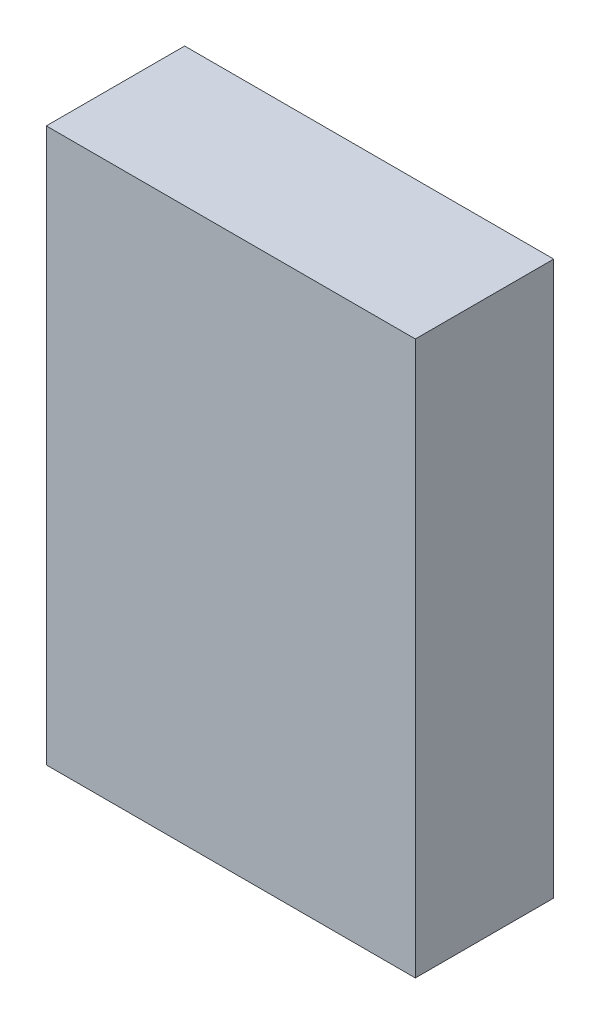
ISO-10303-21;
HEADER;
FILE_DESCRIPTION(('STEP AP214'),'2;1');
FILE_NAME('part.step','',(''),(''),'','','');
FILE_SCHEMA(('AUTOMOTIVE_DESIGN { 1 0 10303 214 1 1 1 1 }'));
ENDSEC;
DATA;
#1=APPLICATION_CONTEXT('core data for automotive mechanical design processes');
#2=APPLICATION_PROTOCOL_DEFINITION('international standard','automotive_design',2000,#1);
#3=PRODUCT_CONTEXT('',#1,'mechanical');
#4=PRODUCT('Part','Part','',(#3));
#5=PRODUCT_RELATED_PRODUCT_CATEGORY('part','',(#4));
#6=PRODUCT_DEFINITION_FORMATION('','',#4);
#7=PRODUCT_DEFINITION_CONTEXT('part definition',#1,'design');
#8=PRODUCT_DEFINITION('design','',#6,#7);
#9=PRODUCT_DEFINITION_SHAPE('','',#8);
#10=(LENGTH_UNIT() NAMED_UNIT(*) SI_UNIT(.MILLI.,.METRE.));
#11=(NAMED_UNIT(*) PLANE_ANGLE_UNIT() SI_UNIT($,.RADIAN.));
#12=(NAMED_UNIT(*) SI_UNIT($,.STERADIAN.) SOLID_ANGLE_UNIT());
#13=UNCERTAINTY_MEASURE_WITH_UNIT(LENGTH_MEASURE(1.E-05),#10,'distance_accuracy_value','');
#14=(GEOMETRIC_REPRESENTATION_CONTEXT(3) GLOBAL_UNCERTAINTY_ASSIGNED_CONTEXT((#13)) GLOBAL_UNIT_ASSIGNED_CONTEXT((#10,
#11,#12)) REPRESENTATION_CONTEXT('',''));
#15=CARTESIAN_POINT('',(0.,0.,0.));
#16=DIRECTION('',(0.,0.,1.));
#17=DIRECTION('',(1.,0.,0.));
#18=AXIS2_PLACEMENT_3D('',#15,#16,#17);
#19=CARTESIAN_POINT('',(609.5,1828.,-228.5));
#20=DIRECTION('',(-1.,0.,0.));
#21=DIRECTION('',(0.,0.,1.));
#22=AXIS2_PLACEMENT_3D('',#19,#20,#21);
#23=PLANE('',#22);
#24=DIRECTION('',(0.,0.,-1.));
#25=VECTOR('',#24,1.);
#26=CARTESIAN_POINT('',(609.5,0.,-228.5));
#27=LINE('',#26,#25);
#28=CARTESIAN_POINT('',(609.500000000001,0.,228.5));
#29=VERTEX_POINT('',#28);
#30=CARTESIAN_POINT('',(609.5,0.,-228.5));
#31=VERTEX_POINT('',#30);
#32=EDGE_CURVE('E107',#29,#31,#27,.T.);
#33=ORIENTED_EDGE('',*,*,#32,.T.);
#34=DIRECTION('',(0.,-1.,0.));
#35=VECTOR('',#34,1.);
#36=CARTESIAN_POINT('',(609.5,1828.,-228.5));
#37=LINE('',#36,#35);
#38=CARTESIAN_POINT('',(609.5,1828.,-228.5));
#39=VERTEX_POINT('',#38);
#40=EDGE_CURVE('E11',#39,#31,#37,.T.);
#41=ORIENTED_EDGE('',*,*,#40,.F.);
#42=DIRECTION('',(0.,0.,-1.));
#43=VECTOR('',#42,1.);
#44=CARTESIAN_POINT('',(609.5,1828.,-228.5));
#45=LINE('',#44,#43);
#46=CARTESIAN_POINT('',(609.500000000001,1828.,228.5));
#47=VERTEX_POINT('',#46);
#48=EDGE_CURVE('E91',#47,#39,#45,.T.);
#49=ORIENTED_EDGE('',*,*,#48,.F.);
#50=DIRECTION('',(0.,-1.,0.));
#51=VECTOR('',#50,1.);
#52=CARTESIAN_POINT('',(609.500000000001,1828.,228.5));
#53=LINE('',#52,#51);
#54=EDGE_CURVE('E103',#47,#29,#53,.T.);
#55=ORIENTED_EDGE('',*,*,#54,.T.);
#56=EDGE_LOOP('',(#33,#41,#49,#55));
#57=FACE_BOUND('',#56,.T.);
#58=ADVANCED_FACE('F39',(#57),#23,.F.);
#59=CARTESIAN_POINT('',(-609.5,1828.,-228.5));
#60=DIRECTION('',(0.,0.,1.));
#61=DIRECTION('',(1.,0.,0.));
#62=AXIS2_PLACEMENT_3D('',#59,#60,#61);
#63=PLANE('',#62);
#64=DIRECTION('',(-1.,0.,0.));
#65=VECTOR('',#64,1.);
#66=CARTESIAN_POINT('',(-609.5,0.,-228.5));
#67=LINE('',#66,#65);
#68=CARTESIAN_POINT('',(-609.5,0.,-228.5));
#69=VERTEX_POINT('',#68);
#70=EDGE_CURVE('E96',#31,#69,#67,.T.);
#71=ORIENTED_EDGE('',*,*,#70,.T.);
#72=DIRECTION('',(0.,-1.,0.));
#73=VECTOR('',#72,1.);
#74=CARTESIAN_POINT('',(-609.5,1828.,-228.5));
#75=LINE('',#74,#73);
#76=CARTESIAN_POINT('',(-609.5,1828.,-228.5));
#77=VERTEX_POINT('',#76);
#78=EDGE_CURVE('E48',#77,#69,#75,.T.);
#79=ORIENTED_EDGE('',*,*,#78,.F.);
#80=DIRECTION('',(-1.,0.,0.));
#81=VECTOR('',#80,1.);
#82=CARTESIAN_POINT('',(-609.5,1828.,-228.5));
#83=LINE('',#82,#81);
#84=EDGE_CURVE('E86',#39,#77,#83,.T.);
#85=ORIENTED_EDGE('',*,*,#84,.F.);
#86=ORIENTED_EDGE('',*,*,#40,.T.);
#87=EDGE_LOOP('',(#71,#79,#85,#86));
#88=FACE_BOUND('',#87,.T.);
#89=ADVANCED_FACE('F95',(#88),#63,.F.);
#90=CARTESIAN_POINT('',(-609.5,1828.,-228.5));
#91=DIRECTION('',(1.,0.,0.));
#92=DIRECTION('',(0.,0.,-1.));
#93=AXIS2_PLACEMENT_3D('',#90,#91,#92);
#94=PLANE('',#93);
#95=DIRECTION('',(0.,0.,1.));
#96=VECTOR('',#95,1.);
#97=CARTESIAN_POINT('',(-609.5,0.,-228.5));
#98=LINE('',#97,#96);
#99=CARTESIAN_POINT('',(-609.499999999999,0.,228.5));
#100=VERTEX_POINT('',#99);
#101=EDGE_CURVE('E73',#69,#100,#98,.T.);
#102=ORIENTED_EDGE('',*,*,#101,.T.);
#103=DIRECTION('',(0.,-1.,0.));
#104=VECTOR('',#103,1.);
#105=CARTESIAN_POINT('',(-609.499999999999,1828.,228.5));
#106=LINE('',#105,#104);
#107=CARTESIAN_POINT('',(-609.499999999999,1828.,228.5));
#108=VERTEX_POINT('',#107);
#109=EDGE_CURVE('E98',#108,#100,#106,.T.);
#110=ORIENTED_EDGE('',*,*,#109,.F.);
#111=DIRECTION('',(0.,0.,1.));
#112=VECTOR('',#111,1.);
#113=CARTESIAN_POINT('',(-609.5,1828.,-228.5));
#114=LINE('',#113,#112);
#115=EDGE_CURVE('E89',#77,#108,#114,.T.);
#116=ORIENTED_EDGE('',*,*,#115,.F.);
#117=ORIENTED_EDGE('',*,*,#78,.T.);
#118=EDGE_LOOP('',(#102,#110,#116,#117));
#119=FACE_BOUND('',#118,.T.);
#120=ADVANCED_FACE('F99',(#119),#94,.F.);
#121=CARTESIAN_POINT('',(-609.499999999999,1828.,228.5));
#122=DIRECTION('',(0.,0.,-1.));
#123=DIRECTION('',(-1.,0.,0.));
#124=AXIS2_PLACEMENT_3D('',#121,#122,#123);
#125=PLANE('',#124);
#126=DIRECTION('',(1.,0.,0.));
#127=VECTOR('',#126,1.);
#128=CARTESIAN_POINT('',(-609.499999999999,0.,228.5));
#129=LINE('',#128,#127);
#130=EDGE_CURVE('E79',#100,#29,#129,.T.);
#131=ORIENTED_EDGE('',*,*,#130,.T.);
#132=ORIENTED_EDGE('',*,*,#54,.F.);
#133=DIRECTION('',(1.,0.,0.));
#134=VECTOR('',#133,1.);
#135=CARTESIAN_POINT('',(-609.499999999999,1828.,228.5));
#136=LINE('',#135,#134);
#137=EDGE_CURVE('E56',#108,#47,#136,.T.);
#138=ORIENTED_EDGE('',*,*,#137,.F.);
#139=ORIENTED_EDGE('',*,*,#109,.T.);
#140=EDGE_LOOP('',(#131,#132,#138,#139));
#141=FACE_BOUND('',#140,.T.);
#142=ADVANCED_FACE('F120',(#141),#125,.F.);
#143=CARTESIAN_POINT('',(0.,1828.,0.));
#144=DIRECTION('',(0.,1.,0.));
#145=DIRECTION('',(0.,0.,1.));
#146=AXIS2_PLACEMENT_3D('',#143,#144,#145);
#147=PLANE('',#146);
#148=ORIENTED_EDGE('',*,*,#48,.T.);
#149=ORIENTED_EDGE('',*,*,#84,.T.);
#150=ORIENTED_EDGE('',*,*,#115,.T.);
#151=ORIENTED_EDGE('',*,*,#137,.T.);
#152=EDGE_LOOP('',(#148,#149,#150,#151));
#153=FACE_BOUND('',#152,.T.);
#154=ADVANCED_FACE('F87',(#153),#147,.T.);
#155=CARTESIAN_POINT('',(0.,0.,0.));
#156=DIRECTION('',(0.,1.,0.));
#157=DIRECTION('',(0.,0.,1.));
#158=AXIS2_PLACEMENT_3D('',#155,#156,#157);
#159=PLANE('',#158);
#160=ORIENTED_EDGE('',*,*,#32,.F.);
#161=ORIENTED_EDGE('',*,*,#130,.F.);
#162=ORIENTED_EDGE('',*,*,#101,.F.);
#163=ORIENTED_EDGE('',*,*,#70,.F.);
#164=EDGE_LOOP('',(#160,#161,#162,#163));
#165=FACE_BOUND('',#164,.T.);
#166=ADVANCED_FACE('F123',(#165),#159,.F.);
#167=CLOSED_SHELL('',(#58,#89,#120,#142,#154,#166));
#168=MANIFOLD_SOLID_BREP('B2',#167);
#169=ADVANCED_BREP_SHAPE_REPRESENTATION('',(#18,#168),#14);
#170=SHAPE_DEFINITION_REPRESENTATION(#9,#169);
ENDSEC;
END-ISO-10303-21;
